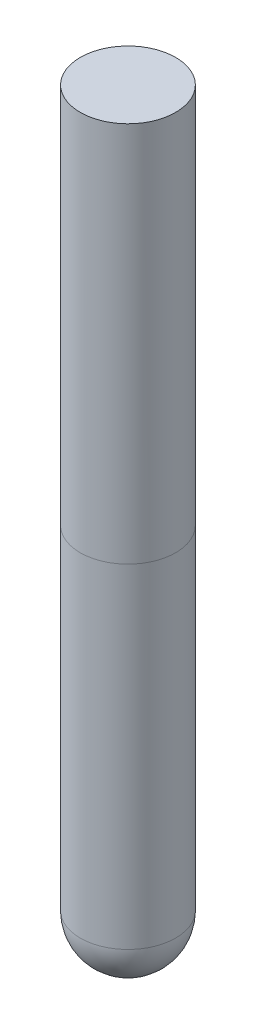
ISO-10303-21;
HEADER;
FILE_DESCRIPTION(('STEP AP214'),'2;1');
FILE_NAME('part.step','',(''),(''),'','','');
FILE_SCHEMA(('AUTOMOTIVE_DESIGN { 1 0 10303 214 1 1 1 1 }'));
ENDSEC;
DATA;
#1=APPLICATION_CONTEXT('core data for automotive mechanical design processes');
#2=APPLICATION_PROTOCOL_DEFINITION('international standard','automotive_design',2000,#1);
#3=PRODUCT_CONTEXT('',#1,'mechanical');
#4=PRODUCT('Part','Part','',(#3));
#5=PRODUCT_RELATED_PRODUCT_CATEGORY('part','',(#4));
#6=PRODUCT_DEFINITION_FORMATION('','',#4);
#7=PRODUCT_DEFINITION_CONTEXT('part definition',#1,'design');
#8=PRODUCT_DEFINITION('design','',#6,#7);
#9=PRODUCT_DEFINITION_SHAPE('','',#8);
#10=(LENGTH_UNIT() NAMED_UNIT(*) SI_UNIT(.MILLI.,.METRE.));
#11=(NAMED_UNIT(*) PLANE_ANGLE_UNIT() SI_UNIT($,.RADIAN.));
#12=(NAMED_UNIT(*) SI_UNIT($,.STERADIAN.) SOLID_ANGLE_UNIT());
#13=UNCERTAINTY_MEASURE_WITH_UNIT(LENGTH_MEASURE(1.E-05),#10,'distance_accuracy_value','');
#14=(GEOMETRIC_REPRESENTATION_CONTEXT(3) GLOBAL_UNCERTAINTY_ASSIGNED_CONTEXT((#13)) GLOBAL_UNIT_ASSIGNED_CONTEXT((#10,
#11,#12)) REPRESENTATION_CONTEXT('',''));
#15=CARTESIAN_POINT('',(0.,0.,0.));
#16=DIRECTION('',(0.,0.,1.));
#17=DIRECTION('',(1.,0.,0.));
#18=AXIS2_PLACEMENT_3D('',#15,#16,#17);
#19=CARTESIAN_POINT('',(0.,0.,0.));
#20=DIRECTION('',(0.,1.,0.));
#21=DIRECTION('',(0.,0.,1.));
#22=AXIS2_PLACEMENT_3D('',#19,#20,#21);
#23=PLANE('',#22);
#24=CARTESIAN_POINT('',(0.,0.,0.));
#25=DIRECTION('',(0.,1.,0.));
#26=DIRECTION('',(0.,0.,1.));
#27=AXIS2_PLACEMENT_3D('',#24,#25,#26);
#28=CIRCLE('',#27,3.175);
#29=CARTESIAN_POINT('',(0.,0.,3.175));
#30=VERTEX_POINT('',#29);
#31=EDGE_CURVE('E46',#30,#30,#28,.T.);
#32=ORIENTED_EDGE('',*,*,#31,.T.);
#33=EDGE_LOOP('',(#32));
#34=FACE_BOUND('',#33,.T.);
#35=ADVANCED_FACE('F42',(#34),#23,.T.);
#36=CARTESIAN_POINT('',(0.,0.,0.));
#37=DIRECTION('',(0.,1.,0.));
#38=DIRECTION('',(-1.,0.,0.));
#39=AXIS2_PLACEMENT_3D('',#36,#37,#38);
#40=CYLINDRICAL_SURFACE('',#39,3.175);
#41=CARTESIAN_POINT('',(0.,-22.225,0.));
#42=DIRECTION('',(0.,1.,0.));
#43=DIRECTION('',(-1.,0.,0.));
#44=AXIS2_PLACEMENT_3D('',#41,#42,#43);
#45=CIRCLE('',#44,3.175);
#46=CARTESIAN_POINT('',(-3.175,-22.225,0.));
#47=VERTEX_POINT('',#46);
#48=EDGE_CURVE('E12',#47,#47,#45,.T.);
#49=ORIENTED_EDGE('',*,*,#48,.T.);
#50=EDGE_LOOP('',(#49));
#51=FACE_BOUND('',#50,.T.);
#52=ORIENTED_EDGE('',*,*,#31,.F.);
#53=EDGE_LOOP('',(#52));
#54=FACE_BOUND('',#53,.T.);
#55=ADVANCED_FACE('F44',(#51,#54),#40,.T.);
#56=CARTESIAN_POINT('',(0.,-22.225,0.));
#57=DIRECTION('',(0.,1.,0.));
#58=DIRECTION('',(1.,0.,0.));
#59=AXIS2_PLACEMENT_3D('',#56,#57,#58);
#60=SPHERICAL_SURFACE('',#59,3.175);
#61=ORIENTED_EDGE('',*,*,#48,.F.);
#62=EDGE_LOOP('',(#61));
#63=FACE_BOUND('',#62,.T.);
#64=ADVANCED_FACE('F57',(#63),#60,.T.);
#65=CLOSED_SHELL('',(#35,#55,#64));
#66=MANIFOLD_SOLID_BREP('B2',#65);
#67=CARTESIAN_POINT('',(0.,0.,0.));
#68=DIRECTION('',(0.,1.,0.));
#69=DIRECTION('',(0.,0.,1.));
#70=AXIS2_PLACEMENT_3D('',#67,#68,#69);
#71=PLANE('',#70);
#72=CARTESIAN_POINT('',(0.,0.,0.));
#73=DIRECTION('',(0.,1.,0.));
#74=DIRECTION('',(0.,0.,1.));
#75=AXIS2_PLACEMENT_3D('',#72,#73,#74);
#76=CIRCLE('',#75,3.175);
#77=CARTESIAN_POINT('',(0.,0.,3.175));
#78=VERTEX_POINT('',#77);
#79=EDGE_CURVE('E41',#78,#78,#76,.T.);
#80=ORIENTED_EDGE('',*,*,#79,.F.);
#81=EDGE_LOOP('',(#80));
#82=FACE_BOUND('',#81,.T.);
#83=ADVANCED_FACE('F86',(#82),#71,.F.);
#84=CARTESIAN_POINT('',(0.,25.4,0.));
#85=DIRECTION('',(0.,1.,0.));
#86=DIRECTION('',(-1.,0.,0.));
#87=AXIS2_PLACEMENT_3D('',#84,#85,#86);
#88=PLANE('',#87);
#89=CARTESIAN_POINT('',(0.,25.4,0.));
#90=DIRECTION('',(0.,1.,0.));
#91=DIRECTION('',(-1.,0.,0.));
#92=AXIS2_PLACEMENT_3D('',#89,#90,#91);
#93=CIRCLE('',#92,3.175);
#94=CARTESIAN_POINT('',(-3.175,25.4,0.));
#95=VERTEX_POINT('',#94);
#96=EDGE_CURVE('E92',#95,#95,#93,.T.);
#97=ORIENTED_EDGE('',*,*,#96,.T.);
#98=EDGE_LOOP('',(#97));
#99=FACE_BOUND('',#98,.T.);
#100=ADVANCED_FACE('F98',(#99),#88,.T.);
#101=CARTESIAN_POINT('',(0.,0.,0.));
#102=DIRECTION('',(0.,1.,0.));
#103=DIRECTION('',(-1.,0.,0.));
#104=AXIS2_PLACEMENT_3D('',#101,#102,#103);
#105=CYLINDRICAL_SURFACE('',#104,3.175);
#106=ORIENTED_EDGE('',*,*,#79,.T.);
#107=EDGE_LOOP('',(#106));
#108=FACE_BOUND('',#107,.T.);
#109=ORIENTED_EDGE('',*,*,#96,.F.);
#110=EDGE_LOOP('',(#109));
#111=FACE_BOUND('',#110,.T.);
#112=ADVANCED_FACE('F100',(#108,#111),#105,.T.);
#113=CLOSED_SHELL('',(#83,#100,#112));
#114=MANIFOLD_SOLID_BREP('B7',#113);
#115=ADVANCED_BREP_SHAPE_REPRESENTATION('',(#18,#66,#114),#14);
#116=SHAPE_DEFINITION_REPRESENTATION(#9,#115);
ENDSEC;
END-ISO-10303-21;
